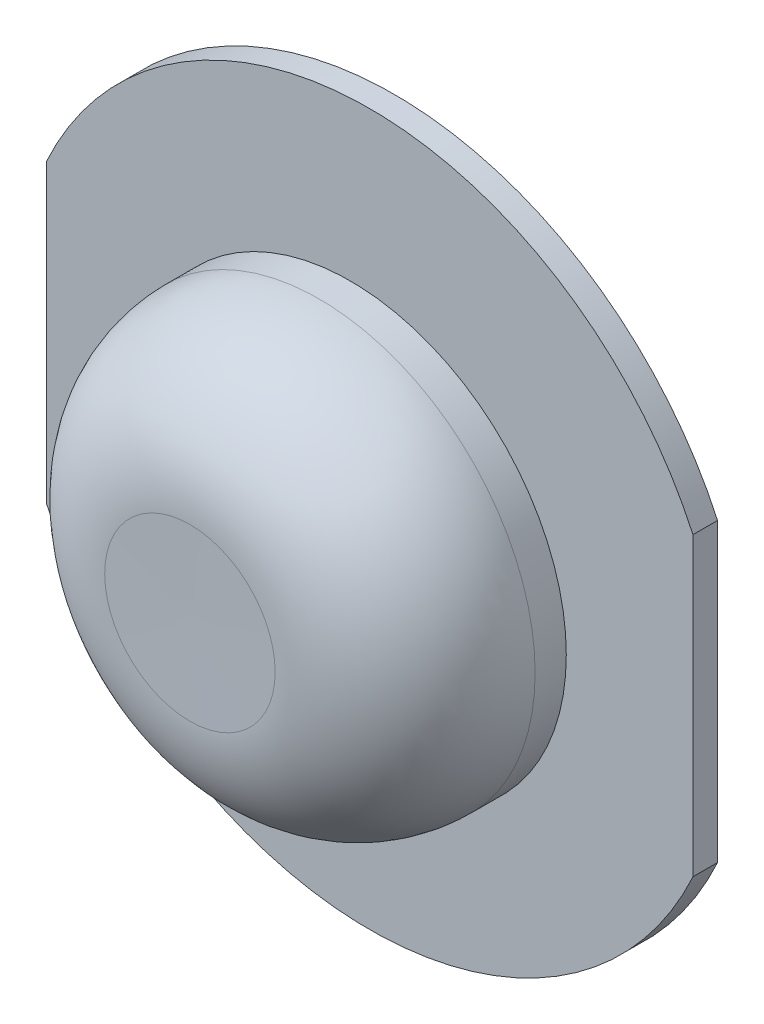
ISO-10303-21;
HEADER;
FILE_DESCRIPTION(('STEP AP214'),'2;1');
FILE_NAME('part.step','',(''),(''),'','','');
FILE_SCHEMA(('AUTOMOTIVE_DESIGN { 1 0 10303 214 1 1 1 1 }'));
ENDSEC;
DATA;
#1=APPLICATION_CONTEXT('core data for automotive mechanical design processes');
#2=APPLICATION_PROTOCOL_DEFINITION('international standard','automotive_design',2000,#1);
#3=PRODUCT_CONTEXT('',#1,'mechanical');
#4=PRODUCT('Part','Part','',(#3));
#5=PRODUCT_RELATED_PRODUCT_CATEGORY('part','',(#4));
#6=PRODUCT_DEFINITION_FORMATION('','',#4);
#7=PRODUCT_DEFINITION_CONTEXT('part definition',#1,'design');
#8=PRODUCT_DEFINITION('design','',#6,#7);
#9=PRODUCT_DEFINITION_SHAPE('','',#8);
#10=(LENGTH_UNIT() NAMED_UNIT(*) SI_UNIT(.MILLI.,.METRE.));
#11=(NAMED_UNIT(*) PLANE_ANGLE_UNIT() SI_UNIT($,.RADIAN.));
#12=(NAMED_UNIT(*) SI_UNIT($,.STERADIAN.) SOLID_ANGLE_UNIT());
#13=UNCERTAINTY_MEASURE_WITH_UNIT(LENGTH_MEASURE(1.E-05),#10,'distance_accuracy_value','');
#14=(GEOMETRIC_REPRESENTATION_CONTEXT(3) GLOBAL_UNCERTAINTY_ASSIGNED_CONTEXT((#13)) GLOBAL_UNIT_ASSIGNED_CONTEXT((#10,
#11,#12)) REPRESENTATION_CONTEXT('',''));
#15=CARTESIAN_POINT('',(0.,0.,0.));
#16=DIRECTION('',(0.,0.,1.));
#17=DIRECTION('',(1.,0.,0.));
#18=AXIS2_PLACEMENT_3D('',#15,#16,#17);
#19=CARTESIAN_POINT('',(0.,0.,6.78852245950168));
#20=DIRECTION('',(0.,0.,1.));
#21=DIRECTION('',(1.,0.,0.));
#22=AXIS2_PLACEMENT_3D('',#19,#20,#21);
#23=PLANE('',#22);
#24=CARTESIAN_POINT('',(0.,0.,6.78852245950168));
#25=DIRECTION('',(0.,0.,-1.));
#26=DIRECTION('',(-1.,0.,0.));
#27=AXIS2_PLACEMENT_3D('',#24,#25,#26);
#28=CIRCLE('',#27,33.395);
#29=CARTESIAN_POINT('',(-33.395,0.,6.78852245950169));
#30=VERTEX_POINT('',#29);
#31=EDGE_CURVE('E12',#30,#30,#28,.T.);
#32=ORIENTED_EDGE('',*,*,#31,.T.);
#33=EDGE_LOOP('',(#32));
#34=FACE_BOUND('',#33,.T.);
#35=ADVANCED_FACE('F49',(#34),#23,.F.);
#36=CARTESIAN_POINT('',(0.,0.,6.78852245950168));
#37=DIRECTION('',(0.,0.,-1.));
#38=DIRECTION('',(-1.,0.,0.));
#39=AXIS2_PLACEMENT_3D('',#36,#37,#38);
#40=CYLINDRICAL_SURFACE('',#39,33.395);
#41=ORIENTED_EDGE('',*,*,#31,.F.);
#42=EDGE_LOOP('',(#41));
#43=FACE_BOUND('',#42,.T.);
#44=CARTESIAN_POINT('',(0.,0.,11.6099198230921));
#45=DIRECTION('',(0.,0.,-1.));
#46=DIRECTION('',(-1.,0.,0.));
#47=AXIS2_PLACEMENT_3D('',#44,#45,#46);
#48=CIRCLE('',#47,33.395);
#49=CARTESIAN_POINT('',(-33.395,0.,11.6099198230921));
#50=VERTEX_POINT('',#49);
#51=EDGE_CURVE('E56',#50,#50,#48,.T.);
#52=ORIENTED_EDGE('',*,*,#51,.T.);
#53=EDGE_LOOP('',(#52));
#54=FACE_BOUND('',#53,.T.);
#55=ADVANCED_FACE('F67',(#43,#54),#40,.T.);
#56=CARTESIAN_POINT('',(0.,0.,11.6099198230921));
#57=DIRECTION('',(0.,0.,-1.));
#58=DIRECTION('',(-1.,0.,0.));
#59=AXIS2_PLACEMENT_3D('',#56,#57,#58);
#60=DEGENERATE_TOROIDAL_SURFACE('',#59,13.395,20.,.T.);
#61=ORIENTED_EDGE('',*,*,#51,.F.);
#62=EDGE_LOOP('',(#61));
#63=FACE_BOUND('',#62,.T.);
#64=CARTESIAN_POINT('',(0.,0.,31.6087877162334));
#65=DIRECTION('',(0.,0.,-1.));
#66=DIRECTION('',(-1.,0.,0.));
#67=AXIS2_PLACEMENT_3D('',#64,#65,#66);
#68=CIRCLE('',#67,13.1822019908878);
#69=CARTESIAN_POINT('',(-13.1822019908878,0.,31.6087877162334));
#70=VERTEX_POINT('',#69);
#71=EDGE_CURVE('E82',#70,#70,#68,.T.);
#72=ORIENTED_EDGE('',*,*,#71,.T.);
#73=EDGE_LOOP('',(#72));
#74=FACE_BOUND('',#73,.T.);
#75=ADVANCED_FACE('F61',(#63,#74),#60,.T.);
#76=CARTESIAN_POINT('',(0.,0.,31.4685224595017));
#77=DIRECTION('',(0.,0.,1.));
#78=DIRECTION('',(1.,0.,0.));
#79=AXIS2_PLACEMENT_3D('',#76,#77,#78);
#80=CONICAL_SURFACE('',#79,0.,1.56015622557634);
#81=ORIENTED_EDGE('',*,*,#71,.F.);
#82=EDGE_LOOP('',(#81));
#83=FACE_BOUND('',#82,.T.);
#84=CARTESIAN_POINT('',(0.,0.,31.4685224595017));
#85=VERTEX_POINT('',#84);
#86=VERTEX_LOOP('',#85);
#87=FACE_BOUND('',#86,.T.);
#88=ADVANCED_FACE('F59',(#83,#87),#80,.F.);
#89=CLOSED_SHELL('',(#35,#55,#75,#88));
#90=MANIFOLD_SOLID_BREP('B2',#89);
#91=CARTESIAN_POINT('',(0.,0.,3.8));
#92=DIRECTION('',(0.,0.,-1.));
#93=DIRECTION('',(-1.,0.,0.));
#94=AXIS2_PLACEMENT_3D('',#91,#92,#93);
#95=CYLINDRICAL_SURFACE('',#94,55.);
#96=CARTESIAN_POINT('',(0.,0.,0.));
#97=DIRECTION('',(0.,0.,1.));
#98=DIRECTION('',(1.,0.,0.));
#99=AXIS2_PLACEMENT_3D('',#96,#97,#98);
#100=CIRCLE('',#99,55.);
#101=CARTESIAN_POINT('',(50.,22.9128784747792,0.));
#102=VERTEX_POINT('',#101);
#103=CARTESIAN_POINT('',(-50.,22.9128784747792,0.));
#104=VERTEX_POINT('',#103);
#105=EDGE_CURVE('E218',#102,#104,#100,.T.);
#106=ORIENTED_EDGE('',*,*,#105,.T.);
#107=DIRECTION('',(0.,0.,-1.));
#108=VECTOR('',#107,1.);
#109=CARTESIAN_POINT('',(-50.,22.9128784747792,3.8));
#110=LINE('',#109,#108);
#111=CARTESIAN_POINT('',(-50.,22.9128784747792,3.8));
#112=VERTEX_POINT('',#111);
#113=EDGE_CURVE('E47',#112,#104,#110,.T.);
#114=ORIENTED_EDGE('',*,*,#113,.F.);
#115=CARTESIAN_POINT('',(0.,0.,3.8));
#116=DIRECTION('',(0.,0.,1.));
#117=DIRECTION('',(1.,0.,0.));
#118=AXIS2_PLACEMENT_3D('',#115,#116,#117);
#119=CIRCLE('',#118,55.);
#120=CARTESIAN_POINT('',(50.,22.9128784747792,3.8));
#121=VERTEX_POINT('',#120);
#122=EDGE_CURVE('E222',#121,#112,#119,.T.);
#123=ORIENTED_EDGE('',*,*,#122,.F.);
#124=DIRECTION('',(0.,0.,-1.));
#125=VECTOR('',#124,1.);
#126=CARTESIAN_POINT('',(50.,22.9128784747792,3.8));
#127=LINE('',#126,#125);
#128=EDGE_CURVE('E228',#121,#102,#127,.T.);
#129=ORIENTED_EDGE('',*,*,#128,.T.);
#130=EDGE_LOOP('',(#106,#114,#123,#129));
#131=FACE_BOUND('',#130,.T.);
#132=ADVANCED_FACE('F110',(#131),#95,.T.);
#133=CARTESIAN_POINT('',(-50.,22.9128784747792,3.8));
#134=DIRECTION('',(1.,0.,0.));
#135=DIRECTION('',(0.,0.,-1.));
#136=AXIS2_PLACEMENT_3D('',#133,#134,#135);
#137=PLANE('',#136);
#138=DIRECTION('',(0.,-1.,0.));
#139=VECTOR('',#138,1.);
#140=CARTESIAN_POINT('',(-50.,22.9128784747792,0.));
#141=LINE('',#140,#139);
#142=CARTESIAN_POINT('',(-50.,-22.9128784747792,0.));
#143=VERTEX_POINT('',#142);
#144=EDGE_CURVE('E231',#104,#143,#141,.T.);
#145=ORIENTED_EDGE('',*,*,#144,.T.);
#146=DIRECTION('',(0.,0.,-1.));
#147=VECTOR('',#146,1.);
#148=CARTESIAN_POINT('',(-50.,-22.9128784747792,3.8));
#149=LINE('',#148,#147);
#150=CARTESIAN_POINT('',(-50.,-22.9128784747792,3.8));
#151=VERTEX_POINT('',#150);
#152=EDGE_CURVE('E117',#151,#143,#149,.T.);
#153=ORIENTED_EDGE('',*,*,#152,.F.);
#154=DIRECTION('',(0.,-1.,0.));
#155=VECTOR('',#154,1.);
#156=CARTESIAN_POINT('',(-50.,22.9128784747792,3.8));
#157=LINE('',#156,#155);
#158=EDGE_CURVE('E161',#112,#151,#157,.T.);
#159=ORIENTED_EDGE('',*,*,#158,.F.);
#160=ORIENTED_EDGE('',*,*,#113,.T.);
#161=EDGE_LOOP('',(#145,#153,#159,#160));
#162=FACE_BOUND('',#161,.T.);
#163=ADVANCED_FACE('F259',(#162),#137,.F.);
#164=CARTESIAN_POINT('',(0.,0.,3.8));
#165=DIRECTION('',(0.,0.,-1.));
#166=DIRECTION('',(-1.,0.,0.));
#167=AXIS2_PLACEMENT_3D('',#164,#165,#166);
#168=CYLINDRICAL_SURFACE('',#167,55.);
#169=CARTESIAN_POINT('',(0.,0.,0.));
#170=DIRECTION('',(0.,0.,1.));
#171=DIRECTION('',(1.,0.,0.));
#172=AXIS2_PLACEMENT_3D('',#169,#170,#171);
#173=CIRCLE('',#172,55.);
#174=CARTESIAN_POINT('',(50.,-22.9128784747792,0.));
#175=VERTEX_POINT('',#174);
#176=EDGE_CURVE('E233',#143,#175,#173,.T.);
#177=ORIENTED_EDGE('',*,*,#176,.T.);
#178=DIRECTION('',(0.,0.,-1.));
#179=VECTOR('',#178,1.);
#180=CARTESIAN_POINT('',(50.,-22.9128784747792,3.8));
#181=LINE('',#180,#179);
#182=CARTESIAN_POINT('',(50.,-22.9128784747792,3.8));
#183=VERTEX_POINT('',#182);
#184=EDGE_CURVE('E237',#183,#175,#181,.T.);
#185=ORIENTED_EDGE('',*,*,#184,.F.);
#186=CARTESIAN_POINT('',(0.,0.,3.8));
#187=DIRECTION('',(0.,0.,1.));
#188=DIRECTION('',(1.,0.,0.));
#189=AXIS2_PLACEMENT_3D('',#186,#187,#188);
#190=CIRCLE('',#189,55.);
#191=EDGE_CURVE('E225',#151,#183,#190,.T.);
#192=ORIENTED_EDGE('',*,*,#191,.F.);
#193=ORIENTED_EDGE('',*,*,#152,.T.);
#194=EDGE_LOOP('',(#177,#185,#192,#193));
#195=FACE_BOUND('',#194,.T.);
#196=ADVANCED_FACE('F242',(#195),#168,.T.);
#197=CARTESIAN_POINT('',(50.,22.9128784747792,3.8));
#198=DIRECTION('',(-1.,0.,0.));
#199=DIRECTION('',(0.,0.,1.));
#200=AXIS2_PLACEMENT_3D('',#197,#198,#199);
#201=PLANE('',#200);
#202=DIRECTION('',(0.,1.,0.));
#203=VECTOR('',#202,1.);
#204=CARTESIAN_POINT('',(50.,22.9128784747792,0.));
#205=LINE('',#204,#203);
#206=EDGE_CURVE('E154',#175,#102,#205,.T.);
#207=ORIENTED_EDGE('',*,*,#206,.T.);
#208=ORIENTED_EDGE('',*,*,#128,.F.);
#209=DIRECTION('',(0.,1.,0.));
#210=VECTOR('',#209,1.);
#211=CARTESIAN_POINT('',(50.,22.9128784747792,3.8));
#212=LINE('',#211,#210);
#213=EDGE_CURVE('E133',#183,#121,#212,.T.);
#214=ORIENTED_EDGE('',*,*,#213,.F.);
#215=ORIENTED_EDGE('',*,*,#184,.T.);
#216=EDGE_LOOP('',(#207,#208,#214,#215));
#217=FACE_BOUND('',#216,.T.);
#218=ADVANCED_FACE('F250',(#217),#201,.F.);
#219=CARTESIAN_POINT('',(0.,0.,3.8));
#220=DIRECTION('',(0.,0.,1.));
#221=DIRECTION('',(1.,0.,0.));
#222=AXIS2_PLACEMENT_3D('',#219,#220,#221);
#223=PLANE('',#222);
#224=ORIENTED_EDGE('',*,*,#122,.T.);
#225=ORIENTED_EDGE('',*,*,#158,.T.);
#226=ORIENTED_EDGE('',*,*,#191,.T.);
#227=ORIENTED_EDGE('',*,*,#213,.T.);
#228=EDGE_LOOP('',(#224,#225,#226,#227));
#229=FACE_BOUND('',#228,.T.);
#230=ADVANCED_FACE('F252',(#229),#223,.T.);
#231=CARTESIAN_POINT('',(0.,0.,0.));
#232=DIRECTION('',(0.,0.,1.));
#233=DIRECTION('',(1.,0.,0.));
#234=AXIS2_PLACEMENT_3D('',#231,#232,#233);
#235=PLANE('',#234);
#236=DIRECTION('',(-1.,0.,0.));
#237=VECTOR('',#236,1.);
#238=CARTESIAN_POINT('',(-21.65,-21.65,0.));
#239=LINE('',#238,#237);
#240=CARTESIAN_POINT('',(21.65,-21.65,0.));
#241=VERTEX_POINT('',#240);
#242=CARTESIAN_POINT('',(-21.65,-21.65,0.));
#243=VERTEX_POINT('',#242);
#244=EDGE_CURVE('E212',#241,#243,#239,.T.);
#245=ORIENTED_EDGE('',*,*,#244,.F.);
#246=DIRECTION('',(0.,-1.,0.));
#247=VECTOR('',#246,1.);
#248=CARTESIAN_POINT('',(21.65,21.65,0.));
#249=LINE('',#248,#247);
#250=CARTESIAN_POINT('',(21.65,21.65,0.));
#251=VERTEX_POINT('',#250);
#252=EDGE_CURVE('E124',#251,#241,#249,.T.);
#253=ORIENTED_EDGE('',*,*,#252,.F.);
#254=DIRECTION('',(1.,0.,0.));
#255=VECTOR('',#254,1.);
#256=CARTESIAN_POINT('',(-21.65,21.65,0.));
#257=LINE('',#256,#255);
#258=CARTESIAN_POINT('',(-21.65,21.65,0.));
#259=VERTEX_POINT('',#258);
#260=EDGE_CURVE('E203',#259,#251,#257,.T.);
#261=ORIENTED_EDGE('',*,*,#260,.F.);
#262=DIRECTION('',(0.,1.,0.));
#263=VECTOR('',#262,1.);
#264=CARTESIAN_POINT('',(-21.65,21.65,0.));
#265=LINE('',#264,#263);
#266=EDGE_CURVE('E206',#243,#259,#265,.T.);
#267=ORIENTED_EDGE('',*,*,#266,.F.);
#268=EDGE_LOOP('',(#245,#253,#261,#267));
#269=FACE_BOUND('',#268,.T.);
#270=ORIENTED_EDGE('',*,*,#105,.F.);
#271=ORIENTED_EDGE('',*,*,#206,.F.);
#272=ORIENTED_EDGE('',*,*,#176,.F.);
#273=ORIENTED_EDGE('',*,*,#144,.F.);
#274=EDGE_LOOP('',(#270,#271,#272,#273));
#275=FACE_BOUND('',#274,.T.);
#276=ADVANCED_FACE('F246',(#269,#275),#235,.F.);
#277=CARTESIAN_POINT('',(21.65,21.65,3.));
#278=DIRECTION('',(1.,0.,0.));
#279=DIRECTION('',(0.,1.,0.));
#280=AXIS2_PLACEMENT_3D('',#277,#278,#279);
#281=PLANE('',#280);
#282=ORIENTED_EDGE('',*,*,#252,.T.);
#283=DIRECTION('',(0.,0.,-1.));
#284=VECTOR('',#283,1.);
#285=CARTESIAN_POINT('',(21.65,-21.65,3.));
#286=LINE('',#285,#284);
#287=CARTESIAN_POINT('',(21.65,-21.65,3.));
#288=VERTEX_POINT('',#287);
#289=EDGE_CURVE('E181',#288,#241,#286,.T.);
#290=ORIENTED_EDGE('',*,*,#289,.F.);
#291=DIRECTION('',(0.,-1.,0.));
#292=VECTOR('',#291,1.);
#293=CARTESIAN_POINT('',(21.65,21.65,3.));
#294=LINE('',#293,#292);
#295=CARTESIAN_POINT('',(21.65,21.65,3.));
#296=VERTEX_POINT('',#295);
#297=EDGE_CURVE('E185',#296,#288,#294,.T.);
#298=ORIENTED_EDGE('',*,*,#297,.F.);
#299=DIRECTION('',(0.,0.,-1.));
#300=VECTOR('',#299,1.);
#301=CARTESIAN_POINT('',(21.65,21.65,3.));
#302=LINE('',#301,#300);
#303=EDGE_CURVE('E216',#296,#251,#302,.T.);
#304=ORIENTED_EDGE('',*,*,#303,.T.);
#305=EDGE_LOOP('',(#282,#290,#298,#304));
#306=FACE_BOUND('',#305,.T.);
#307=ADVANCED_FACE('F183',(#306),#281,.F.);
#308=CARTESIAN_POINT('',(-21.65,21.65,3.));
#309=DIRECTION('',(0.,1.,0.));
#310=DIRECTION('',(-1.,0.,0.));
#311=AXIS2_PLACEMENT_3D('',#308,#309,#310);
#312=PLANE('',#311);
#313=ORIENTED_EDGE('',*,*,#260,.T.);
#314=ORIENTED_EDGE('',*,*,#303,.F.);
#315=DIRECTION('',(1.,0.,0.));
#316=VECTOR('',#315,1.);
#317=CARTESIAN_POINT('',(-21.65,21.65,3.));
#318=LINE('',#317,#316);
#319=CARTESIAN_POINT('',(-21.65,21.65,3.));
#320=VERTEX_POINT('',#319);
#321=EDGE_CURVE('E191',#320,#296,#318,.T.);
#322=ORIENTED_EDGE('',*,*,#321,.F.);
#323=DIRECTION('',(0.,0.,-1.));
#324=VECTOR('',#323,1.);
#325=CARTESIAN_POINT('',(-21.65,21.65,3.));
#326=LINE('',#325,#324);
#327=EDGE_CURVE('E219',#320,#259,#326,.T.);
#328=ORIENTED_EDGE('',*,*,#327,.T.);
#329=EDGE_LOOP('',(#313,#314,#322,#328));
#330=FACE_BOUND('',#329,.T.);
#331=ADVANCED_FACE('F299',(#330),#312,.F.);
#332=CARTESIAN_POINT('',(-21.65,21.65,3.));
#333=DIRECTION('',(-1.,0.,0.));
#334=DIRECTION('',(0.,-1.,0.));
#335=AXIS2_PLACEMENT_3D('',#332,#333,#334);
#336=PLANE('',#335);
#337=ORIENTED_EDGE('',*,*,#266,.T.);
#338=ORIENTED_EDGE('',*,*,#327,.F.);
#339=DIRECTION('',(0.,1.,0.));
#340=VECTOR('',#339,1.);
#341=CARTESIAN_POINT('',(-21.65,21.65,3.));
#342=LINE('',#341,#340);
#343=CARTESIAN_POINT('',(-21.65,-21.65,3.));
#344=VERTEX_POINT('',#343);
#345=EDGE_CURVE('E199',#344,#320,#342,.T.);
#346=ORIENTED_EDGE('',*,*,#345,.F.);
#347=DIRECTION('',(0.,0.,-1.));
#348=VECTOR('',#347,1.);
#349=CARTESIAN_POINT('',(-21.65,-21.65,3.));
#350=LINE('',#349,#348);
#351=EDGE_CURVE('E190',#344,#243,#350,.T.);
#352=ORIENTED_EDGE('',*,*,#351,.T.);
#353=EDGE_LOOP('',(#337,#338,#346,#352));
#354=FACE_BOUND('',#353,.T.);
#355=ADVANCED_FACE('F308',(#354),#336,.F.);
#356=CARTESIAN_POINT('',(-21.65,-21.65,3.));
#357=DIRECTION('',(0.,-1.,0.));
#358=DIRECTION('',(0.,0.,-1.));
#359=AXIS2_PLACEMENT_3D('',#356,#357,#358);
#360=PLANE('',#359);
#361=ORIENTED_EDGE('',*,*,#244,.T.);
#362=ORIENTED_EDGE('',*,*,#351,.F.);
#363=DIRECTION('',(-1.,0.,0.));
#364=VECTOR('',#363,1.);
#365=CARTESIAN_POINT('',(-21.65,-21.65,3.));
#366=LINE('',#365,#364);
#367=EDGE_CURVE('E194',#288,#344,#366,.T.);
#368=ORIENTED_EDGE('',*,*,#367,.F.);
#369=ORIENTED_EDGE('',*,*,#289,.T.);
#370=EDGE_LOOP('',(#361,#362,#368,#369));
#371=FACE_BOUND('',#370,.T.);
#372=ADVANCED_FACE('F195',(#371),#360,.F.);
#373=CARTESIAN_POINT('',(0.,0.,3.));
#374=DIRECTION('',(0.,0.,1.));
#375=DIRECTION('',(1.,0.,0.));
#376=AXIS2_PLACEMENT_3D('',#373,#374,#375);
#377=PLANE('',#376);
#378=ORIENTED_EDGE('',*,*,#297,.T.);
#379=ORIENTED_EDGE('',*,*,#367,.T.);
#380=ORIENTED_EDGE('',*,*,#345,.T.);
#381=ORIENTED_EDGE('',*,*,#321,.T.);
#382=EDGE_LOOP('',(#378,#379,#380,#381));
#383=FACE_BOUND('',#382,.T.);
#384=ADVANCED_FACE('F201',(#383),#377,.F.);
#385=CLOSED_SHELL('',(#132,#163,#196,#218,#230,#276,#307,#331,#355,#372,#384));
#386=MANIFOLD_SOLID_BREP('B6',#385);
#387=ADVANCED_BREP_SHAPE_REPRESENTATION('',(#18,#90,#386),#14);
#388=SHAPE_DEFINITION_REPRESENTATION(#9,#387);
ENDSEC;
END-ISO-10303-21;
